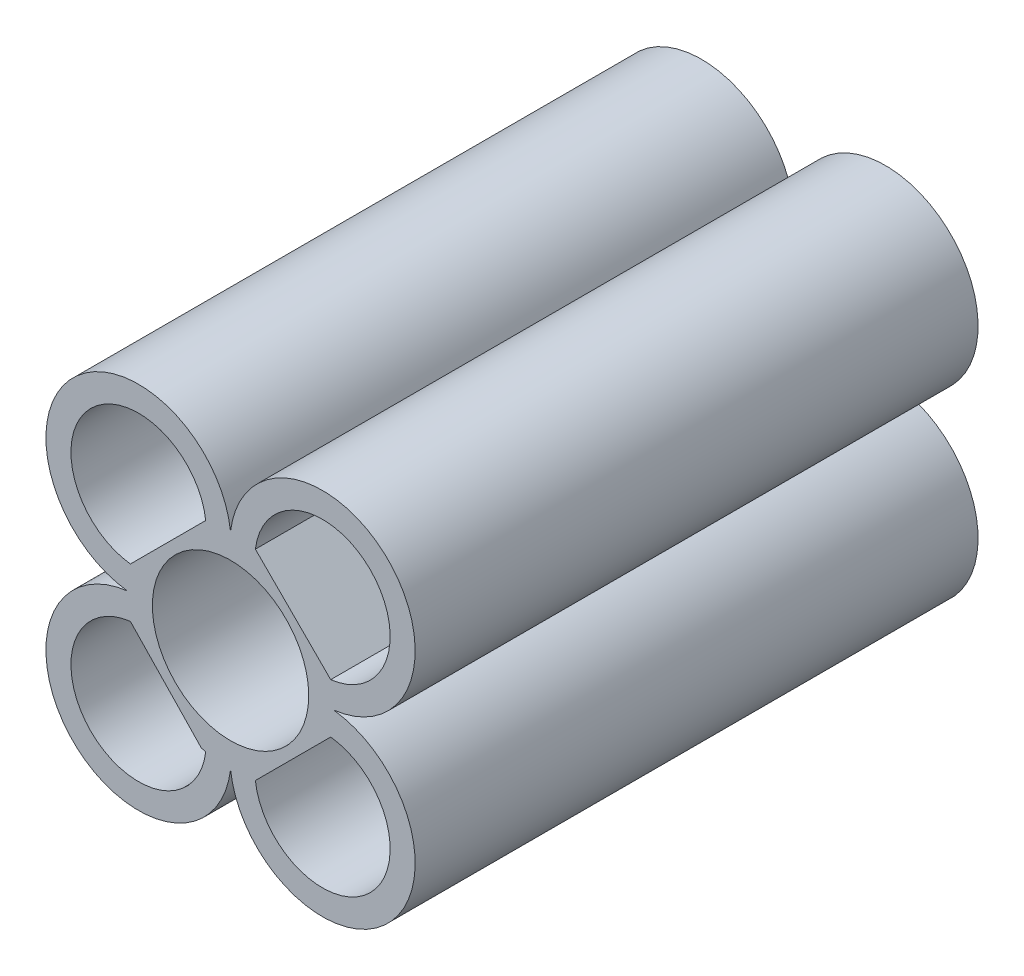
ISO-10303-21;
HEADER;
FILE_DESCRIPTION(('STEP AP214'),'2;1');
FILE_NAME('part.step','',(''),(''),'','','');
FILE_SCHEMA(('AUTOMOTIVE_DESIGN { 1 0 10303 214 1 1 1 1 }'));
ENDSEC;
DATA;
#1=APPLICATION_CONTEXT('core data for automotive mechanical design processes');
#2=APPLICATION_PROTOCOL_DEFINITION('international standard','automotive_design',2000,#1);
#3=PRODUCT_CONTEXT('',#1,'mechanical');
#4=PRODUCT('Part','Part','',(#3));
#5=PRODUCT_RELATED_PRODUCT_CATEGORY('part','',(#4));
#6=PRODUCT_DEFINITION_FORMATION('','',#4);
#7=PRODUCT_DEFINITION_CONTEXT('part definition',#1,'design');
#8=PRODUCT_DEFINITION('design','',#6,#7);
#9=PRODUCT_DEFINITION_SHAPE('','',#8);
#10=(LENGTH_UNIT() NAMED_UNIT(*) SI_UNIT(.MILLI.,.METRE.));
#11=(NAMED_UNIT(*) PLANE_ANGLE_UNIT() SI_UNIT($,.RADIAN.));
#12=(NAMED_UNIT(*) SI_UNIT($,.STERADIAN.) SOLID_ANGLE_UNIT());
#13=UNCERTAINTY_MEASURE_WITH_UNIT(LENGTH_MEASURE(1.E-05),#10,'distance_accuracy_value','');
#14=(GEOMETRIC_REPRESENTATION_CONTEXT(3) GLOBAL_UNCERTAINTY_ASSIGNED_CONTEXT((#13)) GLOBAL_UNIT_ASSIGNED_CONTEXT((#10,
#11,#12)) REPRESENTATION_CONTEXT('',''));
#15=CARTESIAN_POINT('',(0.,0.,0.));
#16=DIRECTION('',(0.,0.,1.));
#17=DIRECTION('',(1.,0.,0.));
#18=AXIS2_PLACEMENT_3D('',#15,#16,#17);
#19=CARTESIAN_POINT('',(-103.423962062668,-98.7857492349925,675.));
#20=DIRECTION('',(0.722943690315747,0.690906955119609,0.));
#21=DIRECTION('',(-0.690906955119609,0.722943690315747,0.));
#22=AXIS2_PLACEMENT_3D('',#19,#20,#21);
#23=PLANE('',#22);
#24=DIRECTION('',(0.690906955119609,-0.722943690315747,0.));
#25=VECTOR('',#24,1.);
#26=CARTESIAN_POINT('',(-103.423962062668,-98.7857492349925,-225.));
#27=LINE('',#26,#25);
#28=CARTESIAN_POINT('',(-160.040518632203,-39.5439337690235,-225.));
#29=VERTEX_POINT('',#28);
#30=CARTESIAN_POINT('',(-46.8074054931319,-158.027564700962,-225.));
#31=VERTEX_POINT('',#30);
#32=EDGE_CURVE('E151',#29,#31,#27,.T.);
#33=ORIENTED_EDGE('',*,*,#32,.T.);
#34=DIRECTION('',(0.,0.,-1.));
#35=VECTOR('',#34,1.);
#36=CARTESIAN_POINT('',(-46.8074054931319,-158.027564700962,675.));
#37=LINE('',#36,#35);
#38=CARTESIAN_POINT('',(-46.8074054931319,-158.027564700962,675.));
#39=VERTEX_POINT('',#38);
#40=EDGE_CURVE('E11',#39,#31,#37,.T.);
#41=ORIENTED_EDGE('',*,*,#40,.F.);
#42=DIRECTION('',(0.690906955119609,-0.722943690315747,0.));
#43=VECTOR('',#42,1.);
#44=CARTESIAN_POINT('',(-103.423962062668,-98.7857492349925,675.));
#45=LINE('',#44,#43);
#46=CARTESIAN_POINT('',(-160.040518632203,-39.5439337690235,675.));
#47=VERTEX_POINT('',#46);
#48=EDGE_CURVE('E146',#47,#39,#45,.T.);
#49=ORIENTED_EDGE('',*,*,#48,.F.);
#50=DIRECTION('',(0.,0.,-1.));
#51=VECTOR('',#50,1.);
#52=CARTESIAN_POINT('',(-160.040518632203,-39.5439337690235,675.));
#53=LINE('',#52,#51);
#54=EDGE_CURVE('E56',#47,#29,#53,.T.);
#55=ORIENTED_EDGE('',*,*,#54,.T.);
#56=EDGE_LOOP('',(#33,#41,#49,#55));
#57=FACE_BOUND('',#56,.T.);
#58=ADVANCED_FACE('F37',(#57),#23,.F.);
#59=CARTESIAN_POINT('',(0.110996519311807,0.161131331968477,675.));
#60=DIRECTION('',(0.,0.,-1.));
#61=DIRECTION('',(-1.,0.,0.));
#62=AXIS2_PLACEMENT_3D('',#59,#60,#61);
#63=CYLINDRICAL_SURFACE('',#62,165.);
#64=CARTESIAN_POINT('',(0.110996519311807,0.161131331968477,-225.));
#65=DIRECTION('',(0.,0.,1.));
#66=DIRECTION('',(1.,0.,0.));
#67=AXIS2_PLACEMENT_3D('',#64,#65,#66);
#68=CIRCLE('',#67,165.);
#69=CARTESIAN_POINT('',(-39.5940685816801,-159.990383819547,-225.));
#70=VERTEX_POINT('',#69);
#71=EDGE_CURVE('E154',#31,#70,#68,.T.);
#72=ORIENTED_EDGE('',*,*,#71,.T.);
#73=DIRECTION('',(0.,0.,-1.));
#74=VECTOR('',#73,1.);
#75=CARTESIAN_POINT('',(-39.5940685816801,-159.990383819547,675.));
#76=LINE('',#75,#74);
#77=CARTESIAN_POINT('',(-39.5940685816801,-159.990383819547,675.));
#78=VERTEX_POINT('',#77);
#79=EDGE_CURVE('E47',#78,#70,#76,.T.);
#80=ORIENTED_EDGE('',*,*,#79,.F.);
#81=CARTESIAN_POINT('',(0.110996519311807,0.161131331968477,675.));
#82=DIRECTION('',(0.,0.,1.));
#83=DIRECTION('',(1.,0.,0.));
#84=AXIS2_PLACEMENT_3D('',#81,#82,#83);
#85=CIRCLE('',#84,165.);
#86=EDGE_CURVE('E139',#39,#78,#85,.T.);
#87=ORIENTED_EDGE('',*,*,#86,.F.);
#88=ORIENTED_EDGE('',*,*,#40,.T.);
#89=EDGE_LOOP('',(#72,#80,#87,#88));
#90=FACE_BOUND('',#89,.T.);
#91=ADVANCED_FACE('F141',(#90),#63,.T.);
#92=CARTESIAN_POINT('',(147.155076039189,-146.882948187908,675.));
#93=DIRECTION('',(0.,0.,-1.));
#94=DIRECTION('',(-1.,0.,0.));
#95=AXIS2_PLACEMENT_3D('',#92,#93,#94);
#96=CYLINDRICAL_SURFACE('',#95,148.136343961016);
#97=CARTESIAN_POINT('',(147.155076039189,-146.882948187908,-225.));
#98=DIRECTION('',(0.,0.,1.));
#99=DIRECTION('',(1.,0.,0.));
#100=AXIS2_PLACEMENT_3D('',#97,#98,#99);
#101=CIRCLE('',#100,148.136343961016);
#102=CARTESIAN_POINT('',(165.110996519312,0.161131331968449,-225.));
#103=VERTEX_POINT('',#102);
#104=CARTESIAN_POINT('',(0.110996519311807,-164.838868668032,-225.));
#105=VERTEX_POINT('',#104);
#106=EDGE_CURVE('E211',#103,#105,#101,.F.);
#107=ORIENTED_EDGE('',*,*,#106,.F.);
#108=DIRECTION('',(0.,0.,-1.));
#109=VECTOR('',#108,1.);
#110=CARTESIAN_POINT('',(165.110996519312,0.161131331968449,675.));
#111=LINE('',#110,#109);
#112=CARTESIAN_POINT('',(165.110996519312,0.161131331968449,675.));
#113=VERTEX_POINT('',#112);
#114=EDGE_CURVE('E167',#113,#103,#111,.T.);
#115=ORIENTED_EDGE('',*,*,#114,.F.);
#116=CARTESIAN_POINT('',(147.155076039189,-146.882948187908,675.));
#117=DIRECTION('',(0.,0.,1.));
#118=DIRECTION('',(1.,0.,0.));
#119=AXIS2_PLACEMENT_3D('',#116,#117,#118);
#120=CIRCLE('',#119,148.136343961016);
#121=CARTESIAN_POINT('',(0.110996519311807,-164.838868668032,675.));
#122=VERTEX_POINT('',#121);
#123=EDGE_CURVE('E238',#113,#122,#120,.F.);
#124=ORIENTED_EDGE('',*,*,#123,.T.);
#125=DIRECTION('',(0.,0.,-1.));
#126=VECTOR('',#125,1.);
#127=CARTESIAN_POINT('',(0.110996519311807,-164.838868668032,675.));
#128=LINE('',#127,#126);
#129=EDGE_CURVE('E169',#122,#105,#128,.T.);
#130=ORIENTED_EDGE('',*,*,#129,.T.);
#131=EDGE_LOOP('',(#107,#115,#124,#130));
#132=FACE_BOUND('',#131,.T.);
#133=ADVANCED_FACE('F237',(#132),#96,.T.);
#134=CARTESIAN_POINT('',(147.155076039189,147.205210851845,675.));
#135=DIRECTION('',(0.,0.,-1.));
#136=DIRECTION('',(-1.,0.,0.));
#137=AXIS2_PLACEMENT_3D('',#134,#135,#136);
#138=CYLINDRICAL_SURFACE('',#137,148.136343961016);
#139=CARTESIAN_POINT('',(147.155076039189,147.205210851845,-225.));
#140=DIRECTION('',(0.,0.,1.));
#141=DIRECTION('',(1.,0.,0.));
#142=AXIS2_PLACEMENT_3D('',#139,#140,#141);
#143=CIRCLE('',#142,148.136343961016);
#144=CARTESIAN_POINT('',(0.110996519311807,165.161131331968,-225.));
#145=VERTEX_POINT('',#144);
#146=EDGE_CURVE('E214',#103,#145,#143,.T.);
#147=ORIENTED_EDGE('',*,*,#146,.T.);
#148=DIRECTION('',(0.,0.,-1.));
#149=VECTOR('',#148,1.);
#150=CARTESIAN_POINT('',(0.110996519311807,165.161131331968,675.));
#151=LINE('',#150,#149);
#152=CARTESIAN_POINT('',(0.110996519311807,165.161131331968,675.));
#153=VERTEX_POINT('',#152);
#154=EDGE_CURVE('E174',#153,#145,#151,.T.);
#155=ORIENTED_EDGE('',*,*,#154,.F.);
#156=CARTESIAN_POINT('',(147.155076039189,147.205210851845,675.));
#157=DIRECTION('',(0.,0.,1.));
#158=DIRECTION('',(1.,0.,0.));
#159=AXIS2_PLACEMENT_3D('',#156,#157,#158);
#160=CIRCLE('',#159,148.136343961016);
#161=EDGE_CURVE('E233',#113,#153,#160,.T.);
#162=ORIENTED_EDGE('',*,*,#161,.F.);
#163=ORIENTED_EDGE('',*,*,#114,.T.);
#164=EDGE_LOOP('',(#147,#155,#162,#163));
#165=FACE_BOUND('',#164,.T.);
#166=ADVANCED_FACE('F232',(#165),#138,.T.);
#167=CARTESIAN_POINT('',(-146.933083000565,147.205210851845,675.));
#168=DIRECTION('',(0.,0.,-1.));
#169=DIRECTION('',(-1.,0.,0.));
#170=AXIS2_PLACEMENT_3D('',#167,#168,#169);
#171=CYLINDRICAL_SURFACE('',#170,148.136343961016);
#172=CARTESIAN_POINT('',(-146.933083000565,147.205210851845,-225.));
#173=DIRECTION('',(0.,0.,1.));
#174=DIRECTION('',(1.,0.,0.));
#175=AXIS2_PLACEMENT_3D('',#172,#173,#174);
#176=CIRCLE('',#175,148.136343961016);
#177=CARTESIAN_POINT('',(-164.889003480688,0.161131331968505,-225.));
#178=VERTEX_POINT('',#177);
#179=EDGE_CURVE('E160',#178,#145,#176,.F.);
#180=ORIENTED_EDGE('',*,*,#179,.F.);
#181=DIRECTION('',(0.,0.,-1.));
#182=VECTOR('',#181,1.);
#183=CARTESIAN_POINT('',(-164.889003480688,0.161131331968505,675.));
#184=LINE('',#183,#182);
#185=CARTESIAN_POINT('',(-164.889003480688,0.161131331968505,675.));
#186=VERTEX_POINT('',#185);
#187=EDGE_CURVE('E171',#186,#178,#184,.T.);
#188=ORIENTED_EDGE('',*,*,#187,.F.);
#189=CARTESIAN_POINT('',(-146.933083000565,147.205210851845,675.));
#190=DIRECTION('',(0.,0.,1.));
#191=DIRECTION('',(1.,0.,0.));
#192=AXIS2_PLACEMENT_3D('',#189,#190,#191);
#193=CIRCLE('',#192,148.136343961016);
#194=EDGE_CURVE('E229',#186,#153,#193,.F.);
#195=ORIENTED_EDGE('',*,*,#194,.T.);
#196=ORIENTED_EDGE('',*,*,#154,.T.);
#197=EDGE_LOOP('',(#180,#188,#195,#196));
#198=FACE_BOUND('',#197,.T.);
#199=ADVANCED_FACE('F224',(#198),#171,.T.);
#200=CARTESIAN_POINT('',(147.155076039189,147.205210851845,675.));
#201=DIRECTION('',(0.,0.,-1.));
#202=DIRECTION('',(-1.,0.,0.));
#203=AXIS2_PLACEMENT_3D('',#200,#201,#202);
#204=CYLINDRICAL_SURFACE('',#203,108.136343961016);
#205=CARTESIAN_POINT('',(147.155076039189,147.205210851845,-225.));
#206=DIRECTION('',(0.,0.,1.));
#207=DIRECTION('',(1.,0.,0.));
#208=AXIS2_PLACEMENT_3D('',#205,#206,#207);
#209=CIRCLE('',#208,108.136343961016);
#210=CARTESIAN_POINT('',(160.262511670827,39.8661964329605,-225.));
#211=VERTEX_POINT('',#210);
#212=CARTESIAN_POINT('',(39.8160616203037,160.312646483484,-225.));
#213=VERTEX_POINT('',#212);
#214=EDGE_CURVE('E205',#211,#213,#209,.T.);
#215=ORIENTED_EDGE('',*,*,#214,.F.);
#216=DIRECTION('',(0.,0.,-1.));
#217=VECTOR('',#216,1.);
#218=CARTESIAN_POINT('',(160.262511670827,39.8661964329605,675.));
#219=LINE('',#218,#217);
#220=CARTESIAN_POINT('',(160.262511670827,39.8661964329605,675.));
#221=VERTEX_POINT('',#220);
#222=EDGE_CURVE('E172',#221,#211,#219,.T.);
#223=ORIENTED_EDGE('',*,*,#222,.F.);
#224=CARTESIAN_POINT('',(147.155076039189,147.205210851845,675.));
#225=DIRECTION('',(0.,0.,1.));
#226=DIRECTION('',(1.,0.,0.));
#227=AXIS2_PLACEMENT_3D('',#224,#225,#226);
#228=CIRCLE('',#227,108.136343961016);
#229=CARTESIAN_POINT('',(39.8160616203037,160.312646483484,675.));
#230=VERTEX_POINT('',#229);
#231=EDGE_CURVE('E250',#221,#230,#228,.T.);
#232=ORIENTED_EDGE('',*,*,#231,.T.);
#233=DIRECTION('',(0.,0.,-1.));
#234=VECTOR('',#233,1.);
#235=CARTESIAN_POINT('',(39.8160616203037,160.312646483484,675.));
#236=LINE('',#235,#234);
#237=EDGE_CURVE('E177',#230,#213,#236,.T.);
#238=ORIENTED_EDGE('',*,*,#237,.T.);
#239=EDGE_LOOP('',(#215,#223,#232,#238));
#240=FACE_BOUND('',#239,.T.);
#241=ADVANCED_FACE('F277',(#240),#204,.F.);
#242=CARTESIAN_POINT('',(-99.8172936069418,100.089421458222,675.));
#243=DIRECTION('',(0.707106781186548,-0.707106781186548,0.));
#244=DIRECTION('',(0.707106781186548,0.707106781186547,0.));
#245=AXIS2_PLACEMENT_3D('',#242,#243,#244);
#246=PLANE('',#245);
#247=DIRECTION('',(-0.707106781186548,-0.707106781186547,0.));
#248=VECTOR('',#247,1.);
#249=CARTESIAN_POINT('',(-99.8172936069418,100.089421458222,-225.));
#250=LINE('',#249,#248);
#251=CARTESIAN_POINT('',(-39.5940685816802,160.312646483484,-225.));
#252=VERTEX_POINT('',#251);
#253=CARTESIAN_POINT('',(-160.040518632203,39.8661964329605,-225.));
#254=VERTEX_POINT('',#253);
#255=EDGE_CURVE('E197',#252,#254,#250,.T.);
#256=ORIENTED_EDGE('',*,*,#255,.T.);
#257=DIRECTION('',(0.,0.,-1.));
#258=VECTOR('',#257,1.);
#259=CARTESIAN_POINT('',(-160.040518632203,39.8661964329605,675.));
#260=LINE('',#259,#258);
#261=CARTESIAN_POINT('',(-160.040518632203,39.8661964329605,675.));
#262=VERTEX_POINT('',#261);
#263=EDGE_CURVE('E179',#262,#254,#260,.T.);
#264=ORIENTED_EDGE('',*,*,#263,.F.);
#265=DIRECTION('',(-0.707106781186548,-0.707106781186547,0.));
#266=VECTOR('',#265,1.);
#267=CARTESIAN_POINT('',(-99.8172936069418,100.089421458222,675.));
#268=LINE('',#267,#266);
#269=CARTESIAN_POINT('',(-39.5940685816802,160.312646483484,675.));
#270=VERTEX_POINT('',#269);
#271=EDGE_CURVE('E258',#270,#262,#268,.T.);
#272=ORIENTED_EDGE('',*,*,#271,.F.);
#273=DIRECTION('',(0.,0.,-1.));
#274=VECTOR('',#273,1.);
#275=CARTESIAN_POINT('',(-39.5940685816802,160.312646483484,675.));
#276=LINE('',#275,#274);
#277=EDGE_CURVE('E181',#270,#252,#276,.T.);
#278=ORIENTED_EDGE('',*,*,#277,.T.);
#279=EDGE_LOOP('',(#256,#264,#272,#278));
#280=FACE_BOUND('',#279,.T.);
#281=ADVANCED_FACE('F311',(#280),#246,.F.);
#282=CARTESIAN_POINT('',(100.039286645565,-99.7671587942851,675.));
#283=DIRECTION('',(-0.707106781186548,0.707106781186548,0.));
#284=DIRECTION('',(-0.707106781186547,-0.707106781186548,0.));
#285=AXIS2_PLACEMENT_3D('',#282,#283,#284);
#286=PLANE('',#285);
#287=DIRECTION('',(0.707106781186547,0.707106781186548,0.));
#288=VECTOR('',#287,1.);
#289=CARTESIAN_POINT('',(100.039286645565,-99.7671587942851,-225.));
#290=LINE('',#289,#288);
#291=CARTESIAN_POINT('',(39.8160616203037,-159.990383819547,-225.));
#292=VERTEX_POINT('',#291);
#293=CARTESIAN_POINT('',(160.262511670827,-39.5439337690235,-225.));
#294=VERTEX_POINT('',#293);
#295=EDGE_CURVE('E193',#292,#294,#290,.T.);
#296=ORIENTED_EDGE('',*,*,#295,.T.);
#297=DIRECTION('',(0.,0.,-1.));
#298=VECTOR('',#297,1.);
#299=CARTESIAN_POINT('',(160.262511670827,-39.5439337690235,675.));
#300=LINE('',#299,#298);
#301=CARTESIAN_POINT('',(160.262511670827,-39.5439337690235,675.));
#302=VERTEX_POINT('',#301);
#303=EDGE_CURVE('E41',#302,#294,#300,.T.);
#304=ORIENTED_EDGE('',*,*,#303,.F.);
#305=DIRECTION('',(0.707106781186547,0.707106781186548,0.));
#306=VECTOR('',#305,1.);
#307=CARTESIAN_POINT('',(100.039286645565,-99.7671587942851,675.));
#308=LINE('',#307,#306);
#309=CARTESIAN_POINT('',(39.8160616203037,-159.990383819547,675.));
#310=VERTEX_POINT('',#309);
#311=EDGE_CURVE('E165',#310,#302,#308,.T.);
#312=ORIENTED_EDGE('',*,*,#311,.F.);
#313=DIRECTION('',(0.,0.,-1.));
#314=VECTOR('',#313,1.);
#315=CARTESIAN_POINT('',(39.8160616203037,-159.990383819547,675.));
#316=LINE('',#315,#314);
#317=EDGE_CURVE('E185',#310,#292,#316,.T.);
#318=ORIENTED_EDGE('',*,*,#317,.T.);
#319=EDGE_LOOP('',(#296,#304,#312,#318));
#320=FACE_BOUND('',#319,.T.);
#321=ADVANCED_FACE('F39',(#320),#286,.F.);
#322=CARTESIAN_POINT('',(-146.933083000565,-146.882948187908,675.));
#323=DIRECTION('',(0.,0.,-1.));
#324=DIRECTION('',(-1.,0.,0.));
#325=AXIS2_PLACEMENT_3D('',#322,#323,#324);
#326=CYLINDRICAL_SURFACE('',#325,148.136343961016);
#327=CARTESIAN_POINT('',(-146.933083000565,-146.882948187908,-225.));
#328=DIRECTION('',(0.,0.,1.));
#329=DIRECTION('',(1.,0.,0.));
#330=AXIS2_PLACEMENT_3D('',#327,#328,#329);
#331=CIRCLE('',#330,148.136343961016);
#332=EDGE_CURVE('E155',#178,#105,#331,.T.);
#333=ORIENTED_EDGE('',*,*,#332,.T.);
#334=ORIENTED_EDGE('',*,*,#129,.F.);
#335=CARTESIAN_POINT('',(-146.933083000565,-146.882948187908,675.));
#336=DIRECTION('',(0.,0.,1.));
#337=DIRECTION('',(1.,0.,0.));
#338=AXIS2_PLACEMENT_3D('',#335,#336,#337);
#339=CIRCLE('',#338,148.136343961016);
#340=EDGE_CURVE('E149',#186,#122,#339,.T.);
#341=ORIENTED_EDGE('',*,*,#340,.F.);
#342=ORIENTED_EDGE('',*,*,#187,.T.);
#343=EDGE_LOOP('',(#333,#334,#341,#342));
#344=FACE_BOUND('',#343,.T.);
#345=ADVANCED_FACE('F241',(#344),#326,.T.);
#346=CARTESIAN_POINT('',(100.039286645565,100.089421458222,675.));
#347=DIRECTION('',(-0.707106781186548,-0.707106781186548,0.));
#348=DIRECTION('',(0.707106781186547,-0.707106781186548,0.));
#349=AXIS2_PLACEMENT_3D('',#346,#347,#348);
#350=PLANE('',#349);
#351=DIRECTION('',(-0.707106781186547,0.707106781186548,0.));
#352=VECTOR('',#351,1.);
#353=CARTESIAN_POINT('',(100.039286645565,100.089421458222,-225.));
#354=LINE('',#353,#352);
#355=EDGE_CURVE('E208',#211,#213,#354,.T.);
#356=ORIENTED_EDGE('',*,*,#355,.T.);
#357=ORIENTED_EDGE('',*,*,#237,.F.);
#358=DIRECTION('',(-0.707106781186547,0.707106781186548,0.));
#359=VECTOR('',#358,1.);
#360=CARTESIAN_POINT('',(100.039286645565,100.089421458222,675.));
#361=LINE('',#360,#359);
#362=EDGE_CURVE('E248',#221,#230,#361,.T.);
#363=ORIENTED_EDGE('',*,*,#362,.F.);
#364=ORIENTED_EDGE('',*,*,#222,.T.);
#365=EDGE_LOOP('',(#356,#357,#363,#364));
#366=FACE_BOUND('',#365,.T.);
#367=ADVANCED_FACE('F282',(#366),#350,.F.);
#368=CARTESIAN_POINT('',(0.110996519311807,0.161131331968477,675.));
#369=DIRECTION('',(0.,0.,-1.));
#370=DIRECTION('',(-1.,0.,0.));
#371=AXIS2_PLACEMENT_3D('',#368,#369,#370);
#372=CYLINDRICAL_SURFACE('',#371,125.);
#373=CARTESIAN_POINT('',(0.110996519311807,0.161131331968477,675.));
#374=DIRECTION('',(0.,0.,1.));
#375=DIRECTION('',(1.,0.,0.));
#376=AXIS2_PLACEMENT_3D('',#373,#374,#375);
#377=CIRCLE('',#376,125.);
#378=CARTESIAN_POINT('',(125.110996519312,0.161131331968477,675.));
#379=VERTEX_POINT('',#378);
#380=EDGE_CURVE('E253',#379,#379,#377,.T.);
#381=ORIENTED_EDGE('',*,*,#380,.T.);
#382=EDGE_LOOP('',(#381));
#383=FACE_BOUND('',#382,.T.);
#384=CARTESIAN_POINT('',(0.110996519311807,0.161131331968477,-225.));
#385=DIRECTION('',(0.,0.,1.));
#386=DIRECTION('',(1.,0.,0.));
#387=AXIS2_PLACEMENT_3D('',#384,#385,#386);
#388=CIRCLE('',#387,125.);
#389=CARTESIAN_POINT('',(125.110996519312,0.161131331968477,-225.));
#390=VERTEX_POINT('',#389);
#391=EDGE_CURVE('E202',#390,#390,#388,.T.);
#392=ORIENTED_EDGE('',*,*,#391,.F.);
#393=EDGE_LOOP('',(#392));
#394=FACE_BOUND('',#393,.T.);
#395=ADVANCED_FACE('F308',(#383,#394),#372,.F.);
#396=CARTESIAN_POINT('',(-146.933083000565,147.205210851845,675.));
#397=DIRECTION('',(0.,0.,-1.));
#398=DIRECTION('',(-1.,0.,0.));
#399=AXIS2_PLACEMENT_3D('',#396,#397,#398);
#400=CYLINDRICAL_SURFACE('',#399,108.136343961016);
#401=CARTESIAN_POINT('',(-146.933083000565,147.205210851845,-225.));
#402=DIRECTION('',(0.,0.,1.));
#403=DIRECTION('',(1.,0.,0.));
#404=AXIS2_PLACEMENT_3D('',#401,#402,#403);
#405=CIRCLE('',#404,108.136343961016);
#406=EDGE_CURVE('E200',#254,#252,#405,.F.);
#407=ORIENTED_EDGE('',*,*,#406,.T.);
#408=ORIENTED_EDGE('',*,*,#277,.F.);
#409=CARTESIAN_POINT('',(-146.933083000565,147.205210851845,675.));
#410=DIRECTION('',(0.,0.,1.));
#411=DIRECTION('',(1.,0.,0.));
#412=AXIS2_PLACEMENT_3D('',#409,#410,#411);
#413=CIRCLE('',#412,108.136343961016);
#414=EDGE_CURVE('E256',#262,#270,#413,.F.);
#415=ORIENTED_EDGE('',*,*,#414,.F.);
#416=ORIENTED_EDGE('',*,*,#263,.T.);
#417=EDGE_LOOP('',(#407,#408,#415,#416));
#418=FACE_BOUND('',#417,.T.);
#419=ADVANCED_FACE('F314',(#418),#400,.F.);
#420=CARTESIAN_POINT('',(147.155076039189,-146.882948187908,675.));
#421=DIRECTION('',(0.,0.,-1.));
#422=DIRECTION('',(-1.,0.,0.));
#423=AXIS2_PLACEMENT_3D('',#420,#421,#422);
#424=CYLINDRICAL_SURFACE('',#423,108.136343961016);
#425=CARTESIAN_POINT('',(147.155076039189,-146.882948187908,-225.));
#426=DIRECTION('',(0.,0.,1.));
#427=DIRECTION('',(1.,0.,0.));
#428=AXIS2_PLACEMENT_3D('',#425,#426,#427);
#429=CIRCLE('',#428,108.136343961016);
#430=EDGE_CURVE('E195',#294,#292,#429,.F.);
#431=ORIENTED_EDGE('',*,*,#430,.T.);
#432=ORIENTED_EDGE('',*,*,#317,.F.);
#433=CARTESIAN_POINT('',(147.155076039189,-146.882948187908,675.));
#434=DIRECTION('',(0.,0.,1.));
#435=DIRECTION('',(1.,0.,0.));
#436=AXIS2_PLACEMENT_3D('',#433,#434,#435);
#437=CIRCLE('',#436,108.136343961016);
#438=EDGE_CURVE('E110',#302,#310,#437,.F.);
#439=ORIENTED_EDGE('',*,*,#438,.F.);
#440=ORIENTED_EDGE('',*,*,#303,.T.);
#441=EDGE_LOOP('',(#431,#432,#439,#440));
#442=FACE_BOUND('',#441,.T.);
#443=ADVANCED_FACE('F265',(#442),#424,.F.);
#444=CARTESIAN_POINT('',(-146.933083000565,-146.882948187908,675.));
#445=DIRECTION('',(0.,0.,-1.));
#446=DIRECTION('',(-1.,0.,0.));
#447=AXIS2_PLACEMENT_3D('',#444,#445,#446);
#448=CYLINDRICAL_SURFACE('',#447,108.136343961016);
#449=CARTESIAN_POINT('',(-146.933083000565,-146.882948187908,-225.));
#450=DIRECTION('',(0.,0.,1.));
#451=DIRECTION('',(1.,0.,0.));
#452=AXIS2_PLACEMENT_3D('',#449,#450,#451);
#453=CIRCLE('',#452,108.136343961016);
#454=EDGE_CURVE('E157',#29,#70,#453,.T.);
#455=ORIENTED_EDGE('',*,*,#454,.F.);
#456=ORIENTED_EDGE('',*,*,#54,.F.);
#457=CARTESIAN_POINT('',(-146.933083000565,-146.882948187908,675.));
#458=DIRECTION('',(0.,0.,1.));
#459=DIRECTION('',(1.,0.,0.));
#460=AXIS2_PLACEMENT_3D('',#457,#458,#459);
#461=CIRCLE('',#460,108.136343961016);
#462=EDGE_CURVE('E145',#47,#78,#461,.T.);
#463=ORIENTED_EDGE('',*,*,#462,.T.);
#464=ORIENTED_EDGE('',*,*,#79,.T.);
#465=EDGE_LOOP('',(#455,#456,#463,#464));
#466=FACE_BOUND('',#465,.T.);
#467=ADVANCED_FACE('F285',(#466),#448,.F.);
#468=CARTESIAN_POINT('',(0.110996519311807,0.161131331968477,675.));
#469=DIRECTION('',(0.,0.,1.));
#470=DIRECTION('',(1.,0.,0.));
#471=AXIS2_PLACEMENT_3D('',#468,#469,#470);
#472=PLANE('',#471);
#473=ORIENTED_EDGE('',*,*,#311,.T.);
#474=ORIENTED_EDGE('',*,*,#438,.T.);
#475=EDGE_LOOP('',(#473,#474));
#476=FACE_BOUND('',#475,.T.);
#477=ORIENTED_EDGE('',*,*,#271,.T.);
#478=ORIENTED_EDGE('',*,*,#414,.T.);
#479=EDGE_LOOP('',(#477,#478));
#480=FACE_BOUND('',#479,.T.);
#481=ORIENTED_EDGE('',*,*,#380,.F.);
#482=EDGE_LOOP('',(#481));
#483=FACE_BOUND('',#482,.T.);
#484=ORIENTED_EDGE('',*,*,#231,.F.);
#485=ORIENTED_EDGE('',*,*,#362,.T.);
#486=EDGE_LOOP('',(#484,#485));
#487=FACE_BOUND('',#486,.T.);
#488=ORIENTED_EDGE('',*,*,#123,.F.);
#489=ORIENTED_EDGE('',*,*,#161,.T.);
#490=ORIENTED_EDGE('',*,*,#194,.F.);
#491=ORIENTED_EDGE('',*,*,#340,.T.);
#492=EDGE_LOOP('',(#488,#489,#490,#491));
#493=FACE_BOUND('',#492,.T.);
#494=ORIENTED_EDGE('',*,*,#48,.T.);
#495=ORIENTED_EDGE('',*,*,#86,.T.);
#496=ORIENTED_EDGE('',*,*,#462,.F.);
#497=EDGE_LOOP('',(#494,#495,#496));
#498=FACE_BOUND('',#497,.T.);
#499=ADVANCED_FACE('F148',(#476,#480,#483,#487,#493,#498),#472,.T.);
#500=CARTESIAN_POINT('',(0.110996519311807,0.161131331968477,-225.));
#501=DIRECTION('',(0.,0.,1.));
#502=DIRECTION('',(1.,0.,0.));
#503=AXIS2_PLACEMENT_3D('',#500,#501,#502);
#504=PLANE('',#503);
#505=ORIENTED_EDGE('',*,*,#295,.F.);
#506=ORIENTED_EDGE('',*,*,#430,.F.);
#507=EDGE_LOOP('',(#505,#506));
#508=FACE_BOUND('',#507,.T.);
#509=ORIENTED_EDGE('',*,*,#255,.F.);
#510=ORIENTED_EDGE('',*,*,#406,.F.);
#511=EDGE_LOOP('',(#509,#510));
#512=FACE_BOUND('',#511,.T.);
#513=ORIENTED_EDGE('',*,*,#391,.T.);
#514=EDGE_LOOP('',(#513));
#515=FACE_BOUND('',#514,.T.);
#516=ORIENTED_EDGE('',*,*,#214,.T.);
#517=ORIENTED_EDGE('',*,*,#355,.F.);
#518=EDGE_LOOP('',(#516,#517));
#519=FACE_BOUND('',#518,.T.);
#520=ORIENTED_EDGE('',*,*,#106,.T.);
#521=ORIENTED_EDGE('',*,*,#332,.F.);
#522=ORIENTED_EDGE('',*,*,#179,.T.);
#523=ORIENTED_EDGE('',*,*,#146,.F.);
#524=EDGE_LOOP('',(#520,#521,#522,#523));
#525=FACE_BOUND('',#524,.T.);
#526=ORIENTED_EDGE('',*,*,#32,.F.);
#527=ORIENTED_EDGE('',*,*,#454,.T.);
#528=ORIENTED_EDGE('',*,*,#71,.F.);
#529=EDGE_LOOP('',(#526,#527,#528));
#530=FACE_BOUND('',#529,.T.);
#531=ADVANCED_FACE('F221',(#508,#512,#515,#519,#525,#530),#504,.F.);
#532=CLOSED_SHELL('',(#58,#91,#133,#166,#199,#241,#281,#321,#345,#367,#395,#419,#443,#467,#499,#531));
#533=MANIFOLD_SOLID_BREP('B2',#532);
#534=ADVANCED_BREP_SHAPE_REPRESENTATION('',(#18,#533),#14);
#535=SHAPE_DEFINITION_REPRESENTATION(#9,#534);
ENDSEC;
END-ISO-10303-21;
